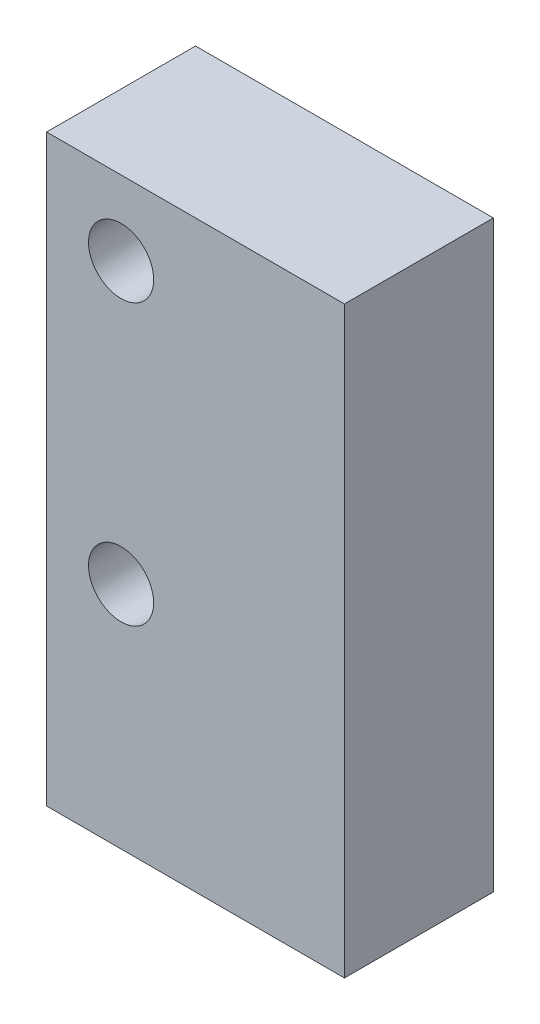
ISO-10303-21;
HEADER;
FILE_DESCRIPTION(('STEP AP214'),'2;1');
FILE_NAME('part.step','',(''),(''),'','','');
FILE_SCHEMA(('AUTOMOTIVE_DESIGN { 1 0 10303 214 1 1 1 1 }'));
ENDSEC;
DATA;
#1=APPLICATION_CONTEXT('core data for automotive mechanical design processes');
#2=APPLICATION_PROTOCOL_DEFINITION('international standard','automotive_design',2000,#1);
#3=PRODUCT_CONTEXT('',#1,'mechanical');
#4=PRODUCT('Part','Part','',(#3));
#5=PRODUCT_RELATED_PRODUCT_CATEGORY('part','',(#4));
#6=PRODUCT_DEFINITION_FORMATION('','',#4);
#7=PRODUCT_DEFINITION_CONTEXT('part definition',#1,'design');
#8=PRODUCT_DEFINITION('design','',#6,#7);
#9=PRODUCT_DEFINITION_SHAPE('','',#8);
#10=(LENGTH_UNIT() NAMED_UNIT(*) SI_UNIT(.MILLI.,.METRE.));
#11=(NAMED_UNIT(*) PLANE_ANGLE_UNIT() SI_UNIT($,.RADIAN.));
#12=(NAMED_UNIT(*) SI_UNIT($,.STERADIAN.) SOLID_ANGLE_UNIT());
#13=UNCERTAINTY_MEASURE_WITH_UNIT(LENGTH_MEASURE(1.E-05),#10,'distance_accuracy_value','');
#14=(GEOMETRIC_REPRESENTATION_CONTEXT(3) GLOBAL_UNCERTAINTY_ASSIGNED_CONTEXT((#13)) GLOBAL_UNIT_ASSIGNED_CONTEXT((#10,
#11,#12)) REPRESENTATION_CONTEXT('',''));
#15=CARTESIAN_POINT('',(0.,0.,0.));
#16=DIRECTION('',(0.,0.,1.));
#17=DIRECTION('',(1.,0.,0.));
#18=AXIS2_PLACEMENT_3D('',#15,#16,#17);
#19=CARTESIAN_POINT('',(0.,0.,6.35));
#20=DIRECTION('',(0.,1.,0.));
#21=DIRECTION('',(0.,0.,1.));
#22=AXIS2_PLACEMENT_3D('',#19,#20,#21);
#23=PLANE('',#22);
#24=DIRECTION('',(1.,0.,0.));
#25=VECTOR('',#24,1.);
#26=CARTESIAN_POINT('',(0.,0.,0.));
#27=LINE('',#26,#25);
#28=CARTESIAN_POINT('',(0.,0.,0.));
#29=VERTEX_POINT('',#28);
#30=CARTESIAN_POINT('',(12.7,0.,0.));
#31=VERTEX_POINT('',#30);
#32=EDGE_CURVE('E116',#29,#31,#27,.T.);
#33=ORIENTED_EDGE('',*,*,#32,.T.);
#34=DIRECTION('',(0.,0.,-1.));
#35=VECTOR('',#34,1.);
#36=CARTESIAN_POINT('',(12.7,0.,6.35));
#37=LINE('',#36,#35);
#38=CARTESIAN_POINT('',(12.7,0.,6.35));
#39=VERTEX_POINT('',#38);
#40=EDGE_CURVE('E11',#39,#31,#37,.T.);
#41=ORIENTED_EDGE('',*,*,#40,.F.);
#42=DIRECTION('',(1.,0.,0.));
#43=VECTOR('',#42,1.);
#44=CARTESIAN_POINT('',(0.,0.,6.35));
#45=LINE('',#44,#43);
#46=CARTESIAN_POINT('',(0.,0.,6.35));
#47=VERTEX_POINT('',#46);
#48=EDGE_CURVE('E90',#47,#39,#45,.T.);
#49=ORIENTED_EDGE('',*,*,#48,.F.);
#50=DIRECTION('',(0.,0.,-1.));
#51=VECTOR('',#50,1.);
#52=CARTESIAN_POINT('',(0.,0.,6.35));
#53=LINE('',#52,#51);
#54=EDGE_CURVE('E57',#47,#29,#53,.T.);
#55=ORIENTED_EDGE('',*,*,#54,.T.);
#56=EDGE_LOOP('',(#33,#41,#49,#55));
#57=FACE_BOUND('',#56,.T.);
#58=ADVANCED_FACE('F39',(#57),#23,.F.);
#59=CARTESIAN_POINT('',(12.7,0.,6.35));
#60=DIRECTION('',(-1.,0.,0.));
#61=DIRECTION('',(0.,0.,1.));
#62=AXIS2_PLACEMENT_3D('',#59,#60,#61);
#63=PLANE('',#62);
#64=DIRECTION('',(0.,1.,0.));
#65=VECTOR('',#64,1.);
#66=CARTESIAN_POINT('',(12.7,0.,0.));
#67=LINE('',#66,#65);
#68=CARTESIAN_POINT('',(12.7,24.892,0.));
#69=VERTEX_POINT('',#68);
#70=EDGE_CURVE('E96',#31,#69,#67,.T.);
#71=ORIENTED_EDGE('',*,*,#70,.T.);
#72=DIRECTION('',(0.,0.,-1.));
#73=VECTOR('',#72,1.);
#74=CARTESIAN_POINT('',(12.7,24.892,6.35));
#75=LINE('',#74,#73);
#76=CARTESIAN_POINT('',(12.7,24.892,6.35));
#77=VERTEX_POINT('',#76);
#78=EDGE_CURVE('E49',#77,#69,#75,.T.);
#79=ORIENTED_EDGE('',*,*,#78,.F.);
#80=DIRECTION('',(0.,1.,0.));
#81=VECTOR('',#80,1.);
#82=CARTESIAN_POINT('',(12.7,0.,6.35));
#83=LINE('',#82,#81);
#84=EDGE_CURVE('E82',#39,#77,#83,.T.);
#85=ORIENTED_EDGE('',*,*,#84,.F.);
#86=ORIENTED_EDGE('',*,*,#40,.T.);
#87=EDGE_LOOP('',(#71,#79,#85,#86));
#88=FACE_BOUND('',#87,.T.);
#89=ADVANCED_FACE('F95',(#88),#63,.F.);
#90=CARTESIAN_POINT('',(0.,24.892,6.35));
#91=DIRECTION('',(0.,1.,0.));
#92=DIRECTION('',(0.,0.,1.));
#93=AXIS2_PLACEMENT_3D('',#90,#91,#92);
#94=PLANE('',#93);
#95=DIRECTION('',(1.,0.,0.));
#96=VECTOR('',#95,1.);
#97=CARTESIAN_POINT('',(0.,24.892,0.));
#98=LINE('',#97,#96);
#99=CARTESIAN_POINT('',(0.,24.892,0.));
#100=VERTEX_POINT('',#99);
#101=EDGE_CURVE('E121',#100,#69,#98,.T.);
#102=ORIENTED_EDGE('',*,*,#101,.F.);
#103=DIRECTION('',(0.,0.,-1.));
#104=VECTOR('',#103,1.);
#105=CARTESIAN_POINT('',(0.,24.892,6.35));
#106=LINE('',#105,#104);
#107=CARTESIAN_POINT('',(0.,24.892,6.35));
#108=VERTEX_POINT('',#107);
#109=EDGE_CURVE('E71',#108,#100,#106,.T.);
#110=ORIENTED_EDGE('',*,*,#109,.F.);
#111=DIRECTION('',(1.,0.,0.));
#112=VECTOR('',#111,1.);
#113=CARTESIAN_POINT('',(0.,24.892,6.35));
#114=LINE('',#113,#112);
#115=EDGE_CURVE('E89',#108,#77,#114,.T.);
#116=ORIENTED_EDGE('',*,*,#115,.T.);
#117=ORIENTED_EDGE('',*,*,#78,.T.);
#118=EDGE_LOOP('',(#102,#110,#116,#117));
#119=FACE_BOUND('',#118,.T.);
#120=ADVANCED_FACE('F100',(#119),#94,.T.);
#121=CARTESIAN_POINT('',(3.175,21.717,6.35));
#122=DIRECTION('',(0.,0.,-1.));
#123=DIRECTION('',(-1.,0.,0.));
#124=AXIS2_PLACEMENT_3D('',#121,#122,#123);
#125=CYLINDRICAL_SURFACE('',#124,1.3890625);
#126=CARTESIAN_POINT('',(3.175,21.717,6.35));
#127=DIRECTION('',(0.,0.,1.));
#128=DIRECTION('',(1.,0.,0.));
#129=AXIS2_PLACEMENT_3D('',#126,#127,#128);
#130=CIRCLE('',#129,1.3890625);
#131=CARTESIAN_POINT('',(4.5640625,21.717,6.35));
#132=VERTEX_POINT('',#131);
#133=EDGE_CURVE('E135',#132,#132,#130,.T.);
#134=ORIENTED_EDGE('',*,*,#133,.T.);
#135=EDGE_LOOP('',(#134));
#136=FACE_BOUND('',#135,.T.);
#137=CARTESIAN_POINT('',(3.175,21.717,0.));
#138=DIRECTION('',(0.,0.,1.));
#139=DIRECTION('',(1.,0.,0.));
#140=AXIS2_PLACEMENT_3D('',#137,#138,#139);
#141=CIRCLE('',#140,1.3890625);
#142=CARTESIAN_POINT('',(4.5640625,21.717,0.));
#143=VERTEX_POINT('',#142);
#144=EDGE_CURVE('E112',#143,#143,#141,.T.);
#145=ORIENTED_EDGE('',*,*,#144,.F.);
#146=EDGE_LOOP('',(#145));
#147=FACE_BOUND('',#146,.T.);
#148=ADVANCED_FACE('F145',(#136,#147),#125,.F.);
#149=CARTESIAN_POINT('',(3.175,9.779,6.35));
#150=DIRECTION('',(0.,0.,-1.));
#151=DIRECTION('',(-1.,0.,0.));
#152=AXIS2_PLACEMENT_3D('',#149,#150,#151);
#153=CYLINDRICAL_SURFACE('',#152,1.3890625);
#154=CARTESIAN_POINT('',(3.175,9.779,6.35));
#155=DIRECTION('',(0.,0.,1.));
#156=DIRECTION('',(1.,0.,0.));
#157=AXIS2_PLACEMENT_3D('',#154,#155,#156);
#158=CIRCLE('',#157,1.3890625);
#159=CARTESIAN_POINT('',(4.5640625,9.779,6.35));
#160=VERTEX_POINT('',#159);
#161=EDGE_CURVE('E128',#160,#160,#158,.T.);
#162=ORIENTED_EDGE('',*,*,#161,.T.);
#163=EDGE_LOOP('',(#162));
#164=FACE_BOUND('',#163,.T.);
#165=CARTESIAN_POINT('',(3.175,9.779,0.));
#166=DIRECTION('',(0.,0.,1.));
#167=DIRECTION('',(1.,0.,0.));
#168=AXIS2_PLACEMENT_3D('',#165,#166,#167);
#169=CIRCLE('',#168,1.3890625);
#170=CARTESIAN_POINT('',(4.5640625,9.779,0.));
#171=VERTEX_POINT('',#170);
#172=EDGE_CURVE('E108',#171,#171,#169,.T.);
#173=ORIENTED_EDGE('',*,*,#172,.F.);
#174=EDGE_LOOP('',(#173));
#175=FACE_BOUND('',#174,.T.);
#176=ADVANCED_FACE('F41',(#164,#175),#153,.F.);
#177=CARTESIAN_POINT('',(0.,0.,6.35));
#178=DIRECTION('',(-1.,0.,0.));
#179=DIRECTION('',(0.,0.,1.));
#180=AXIS2_PLACEMENT_3D('',#177,#178,#179);
#181=PLANE('',#180);
#182=DIRECTION('',(0.,1.,0.));
#183=VECTOR('',#182,1.);
#184=CARTESIAN_POINT('',(0.,0.,0.));
#185=LINE('',#184,#183);
#186=EDGE_CURVE('E124',#29,#100,#185,.T.);
#187=ORIENTED_EDGE('',*,*,#186,.F.);
#188=ORIENTED_EDGE('',*,*,#54,.F.);
#189=DIRECTION('',(0.,1.,0.));
#190=VECTOR('',#189,1.);
#191=CARTESIAN_POINT('',(0.,0.,6.35));
#192=LINE('',#191,#190);
#193=EDGE_CURVE('E102',#47,#108,#192,.T.);
#194=ORIENTED_EDGE('',*,*,#193,.T.);
#195=ORIENTED_EDGE('',*,*,#109,.T.);
#196=EDGE_LOOP('',(#187,#188,#194,#195));
#197=FACE_BOUND('',#196,.T.);
#198=ADVANCED_FACE('F150',(#197),#181,.T.);
#199=CARTESIAN_POINT('',(0.,0.,6.35));
#200=DIRECTION('',(0.,0.,1.));
#201=DIRECTION('',(1.,0.,0.));
#202=AXIS2_PLACEMENT_3D('',#199,#200,#201);
#203=PLANE('',#202);
#204=ORIENTED_EDGE('',*,*,#161,.F.);
#205=EDGE_LOOP('',(#204));
#206=FACE_BOUND('',#205,.T.);
#207=ORIENTED_EDGE('',*,*,#133,.F.);
#208=EDGE_LOOP('',(#207));
#209=FACE_BOUND('',#208,.T.);
#210=ORIENTED_EDGE('',*,*,#48,.T.);
#211=ORIENTED_EDGE('',*,*,#84,.T.);
#212=ORIENTED_EDGE('',*,*,#115,.F.);
#213=ORIENTED_EDGE('',*,*,#193,.F.);
#214=EDGE_LOOP('',(#210,#211,#212,#213));
#215=FACE_BOUND('',#214,.T.);
#216=ADVANCED_FACE('F86',(#206,#209,#215),#203,.T.);
#217=CARTESIAN_POINT('',(0.,0.,0.));
#218=DIRECTION('',(0.,0.,1.));
#219=DIRECTION('',(1.,0.,0.));
#220=AXIS2_PLACEMENT_3D('',#217,#218,#219);
#221=PLANE('',#220);
#222=ORIENTED_EDGE('',*,*,#172,.T.);
#223=EDGE_LOOP('',(#222));
#224=FACE_BOUND('',#223,.T.);
#225=ORIENTED_EDGE('',*,*,#144,.T.);
#226=EDGE_LOOP('',(#225));
#227=FACE_BOUND('',#226,.T.);
#228=ORIENTED_EDGE('',*,*,#32,.F.);
#229=ORIENTED_EDGE('',*,*,#186,.T.);
#230=ORIENTED_EDGE('',*,*,#101,.T.);
#231=ORIENTED_EDGE('',*,*,#70,.F.);
#232=EDGE_LOOP('',(#228,#229,#230,#231));
#233=FACE_BOUND('',#232,.T.);
#234=ADVANCED_FACE('F149',(#224,#227,#233),#221,.F.);
#235=CLOSED_SHELL('',(#58,#89,#120,#148,#176,#198,#216,#234));
#236=MANIFOLD_SOLID_BREP('B2',#235);
#237=ADVANCED_BREP_SHAPE_REPRESENTATION('',(#18,#236),#14);
#238=SHAPE_DEFINITION_REPRESENTATION(#9,#237);
ENDSEC;
END-ISO-10303-21;
